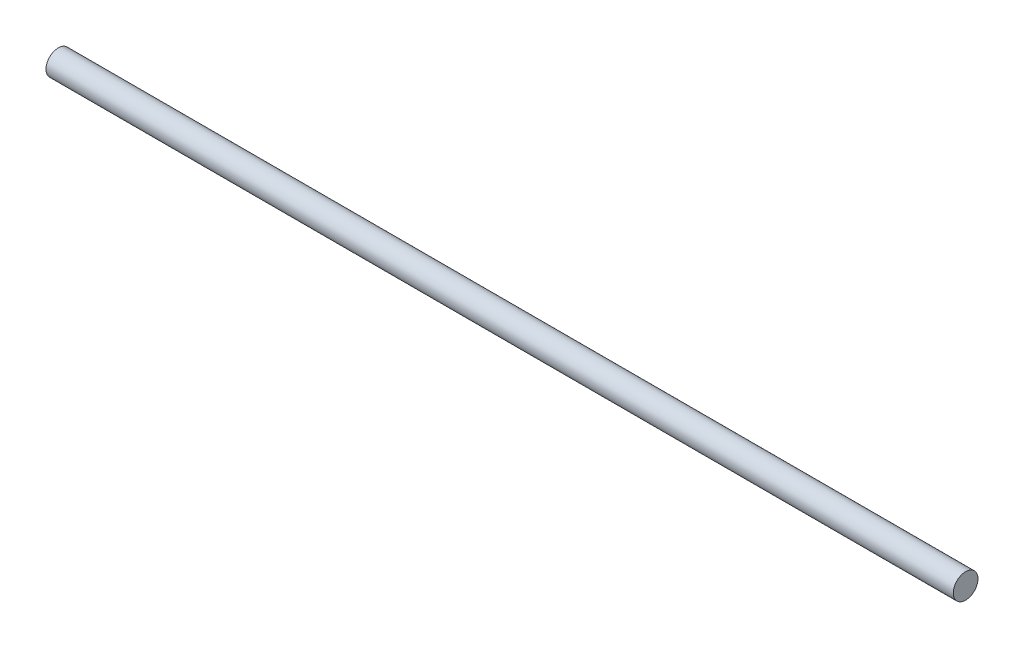
ISO-10303-21;
HEADER;
FILE_DESCRIPTION(('STEP AP214'),'2;1');
FILE_NAME('part.step','',(''),(''),'','','');
FILE_SCHEMA(('AUTOMOTIVE_DESIGN { 1 0 10303 214 1 1 1 1 }'));
ENDSEC;
DATA;
#1=APPLICATION_CONTEXT('core data for automotive mechanical design processes');
#2=APPLICATION_PROTOCOL_DEFINITION('international standard','automotive_design',2000,#1);
#3=PRODUCT_CONTEXT('',#1,'mechanical');
#4=PRODUCT('Part','Part','',(#3));
#5=PRODUCT_RELATED_PRODUCT_CATEGORY('part','',(#4));
#6=PRODUCT_DEFINITION_FORMATION('','',#4);
#7=PRODUCT_DEFINITION_CONTEXT('part definition',#1,'design');
#8=PRODUCT_DEFINITION('design','',#6,#7);
#9=PRODUCT_DEFINITION_SHAPE('','',#8);
#10=(LENGTH_UNIT() NAMED_UNIT(*) SI_UNIT(.MILLI.,.METRE.));
#11=(NAMED_UNIT(*) PLANE_ANGLE_UNIT() SI_UNIT($,.RADIAN.));
#12=(NAMED_UNIT(*) SI_UNIT($,.STERADIAN.) SOLID_ANGLE_UNIT());
#13=UNCERTAINTY_MEASURE_WITH_UNIT(LENGTH_MEASURE(1.E-05),#10,'distance_accuracy_value','');
#14=(GEOMETRIC_REPRESENTATION_CONTEXT(3) GLOBAL_UNCERTAINTY_ASSIGNED_CONTEXT((#13)) GLOBAL_UNIT_ASSIGNED_CONTEXT((#10,
#11,#12)) REPRESENTATION_CONTEXT('',''));
#15=CARTESIAN_POINT('',(0.,0.,0.));
#16=DIRECTION('',(0.,0.,1.));
#17=DIRECTION('',(1.,0.,0.));
#18=AXIS2_PLACEMENT_3D('',#15,#16,#17);
#19=CARTESIAN_POINT('',(110.,0.,0.));
#20=DIRECTION('',(-1.,0.,0.));
#21=DIRECTION('',(0.,0.,1.));
#22=AXIS2_PLACEMENT_3D('',#19,#20,#21);
#23=CYLINDRICAL_SURFACE('',#22,1.5);
#24=CARTESIAN_POINT('',(110.,0.,0.));
#25=DIRECTION('',(1.,0.,0.));
#26=DIRECTION('',(0.,0.,-1.));
#27=AXIS2_PLACEMENT_3D('',#24,#25,#26);
#28=CIRCLE('',#27,1.5);
#29=CARTESIAN_POINT('',(110.,0.,-1.5));
#30=VERTEX_POINT('',#29);
#31=EDGE_CURVE('E10',#30,#30,#28,.T.);
#32=ORIENTED_EDGE('',*,*,#31,.F.);
#33=EDGE_LOOP('',(#32));
#34=FACE_BOUND('',#33,.T.);
#35=CARTESIAN_POINT('',(0.,0.,0.));
#36=DIRECTION('',(1.,0.,0.));
#37=DIRECTION('',(0.,0.,-1.));
#38=AXIS2_PLACEMENT_3D('',#35,#36,#37);
#39=CIRCLE('',#38,1.5);
#40=CARTESIAN_POINT('',(0.,0.,-1.5));
#41=VERTEX_POINT('',#40);
#42=EDGE_CURVE('E34',#41,#41,#39,.T.);
#43=ORIENTED_EDGE('',*,*,#42,.T.);
#44=EDGE_LOOP('',(#43));
#45=FACE_BOUND('',#44,.T.);
#46=ADVANCED_FACE('F31',(#34,#45),#23,.T.);
#47=CARTESIAN_POINT('',(110.,0.,0.));
#48=DIRECTION('',(1.,0.,0.));
#49=DIRECTION('',(0.,0.,-1.));
#50=AXIS2_PLACEMENT_3D('',#47,#48,#49);
#51=PLANE('',#50);
#52=ORIENTED_EDGE('',*,*,#31,.T.);
#53=EDGE_LOOP('',(#52));
#54=FACE_BOUND('',#53,.T.);
#55=ADVANCED_FACE('F46',(#54),#51,.T.);
#56=CARTESIAN_POINT('',(0.,0.,0.));
#57=DIRECTION('',(1.,0.,0.));
#58=DIRECTION('',(0.,0.,-1.));
#59=AXIS2_PLACEMENT_3D('',#56,#57,#58);
#60=PLANE('',#59);
#61=ORIENTED_EDGE('',*,*,#42,.F.);
#62=EDGE_LOOP('',(#61));
#63=FACE_BOUND('',#62,.T.);
#64=ADVANCED_FACE('F44',(#63),#60,.F.);
#65=CLOSED_SHELL('',(#46,#55,#64));
#66=MANIFOLD_SOLID_BREP('B2',#65);
#67=ADVANCED_BREP_SHAPE_REPRESENTATION('',(#18,#66),#14);
#68=SHAPE_DEFINITION_REPRESENTATION(#9,#67);
ENDSEC;
END-ISO-10303-21;
